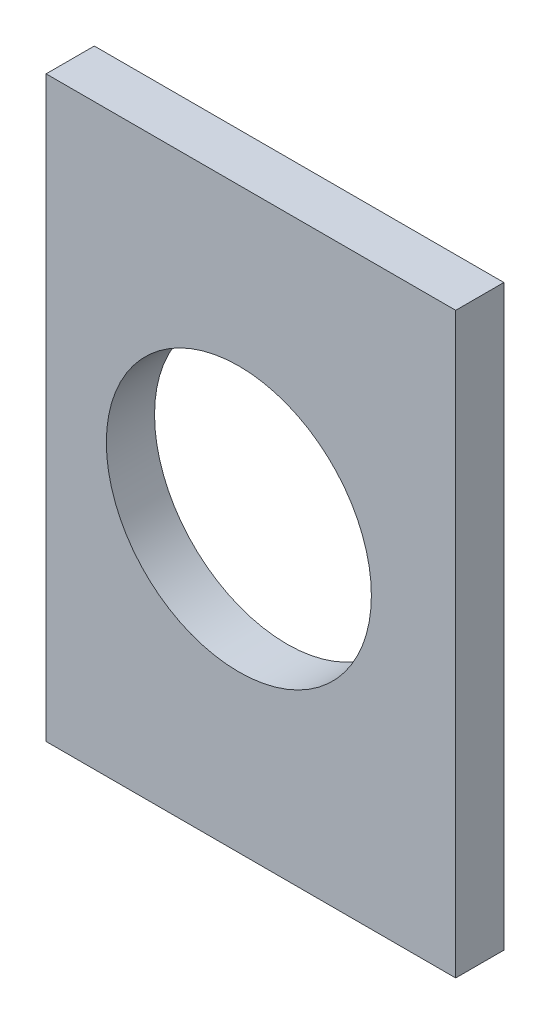
ISO-10303-21;
HEADER;
FILE_DESCRIPTION(('STEP AP214'),'2;1');
FILE_NAME('part.step','',(''),(''),'','','');
FILE_SCHEMA(('AUTOMOTIVE_DESIGN { 1 0 10303 214 1 1 1 1 }'));
ENDSEC;
DATA;
#1=APPLICATION_CONTEXT('core data for automotive mechanical design processes');
#2=APPLICATION_PROTOCOL_DEFINITION('international standard','automotive_design',2000,#1);
#3=PRODUCT_CONTEXT('',#1,'mechanical');
#4=PRODUCT('Part','Part','',(#3));
#5=PRODUCT_RELATED_PRODUCT_CATEGORY('part','',(#4));
#6=PRODUCT_DEFINITION_FORMATION('','',#4);
#7=PRODUCT_DEFINITION_CONTEXT('part definition',#1,'design');
#8=PRODUCT_DEFINITION('design','',#6,#7);
#9=PRODUCT_DEFINITION_SHAPE('','',#8);
#10=(LENGTH_UNIT() NAMED_UNIT(*) SI_UNIT(.MILLI.,.METRE.));
#11=(NAMED_UNIT(*) PLANE_ANGLE_UNIT() SI_UNIT($,.RADIAN.));
#12=(NAMED_UNIT(*) SI_UNIT($,.STERADIAN.) SOLID_ANGLE_UNIT());
#13=UNCERTAINTY_MEASURE_WITH_UNIT(LENGTH_MEASURE(1.E-05),#10,'distance_accuracy_value','');
#14=(GEOMETRIC_REPRESENTATION_CONTEXT(3) GLOBAL_UNCERTAINTY_ASSIGNED_CONTEXT((#13)) GLOBAL_UNIT_ASSIGNED_CONTEXT((#10,
#11,#12)) REPRESENTATION_CONTEXT('',''));
#15=CARTESIAN_POINT('',(0.,0.,0.));
#16=DIRECTION('',(0.,0.,1.));
#17=DIRECTION('',(1.,0.,0.));
#18=AXIS2_PLACEMENT_3D('',#15,#16,#17);
#19=CARTESIAN_POINT('',(0.,0.,1.));
#20=DIRECTION('',(0.,0.,1.));
#21=DIRECTION('',(1.,0.,0.));
#22=AXIS2_PLACEMENT_3D('',#19,#20,#21);
#23=PLANE('',#22);
#24=DIRECTION('',(0.,-1.,0.));
#25=VECTOR('',#24,1.);
#26=CARTESIAN_POINT('',(94.5,6.,1.));
#27=LINE('',#26,#25);
#28=CARTESIAN_POINT('',(94.5,6.,1.));
#29=VERTEX_POINT('',#28);
#30=CARTESIAN_POINT('',(94.5,-6.,1.));
#31=VERTEX_POINT('',#30);
#32=EDGE_CURVE('E91',#29,#31,#27,.T.);
#33=ORIENTED_EDGE('',*,*,#32,.T.);
#34=DIRECTION('',(1.,0.,0.));
#35=VECTOR('',#34,1.);
#36=CARTESIAN_POINT('',(94.5,-6.,1.));
#37=LINE('',#36,#35);
#38=CARTESIAN_POINT('',(103.,-6.,1.));
#39=VERTEX_POINT('',#38);
#40=EDGE_CURVE('E86',#31,#39,#37,.T.);
#41=ORIENTED_EDGE('',*,*,#40,.T.);
#42=DIRECTION('',(0.,1.,0.));
#43=VECTOR('',#42,1.);
#44=CARTESIAN_POINT('',(103.,-6.,1.));
#45=LINE('',#44,#43);
#46=CARTESIAN_POINT('',(103.,6.,1.));
#47=VERTEX_POINT('',#46);
#48=EDGE_CURVE('E89',#39,#47,#45,.T.);
#49=ORIENTED_EDGE('',*,*,#48,.T.);
#50=DIRECTION('',(-1.,0.,0.));
#51=VECTOR('',#50,1.);
#52=CARTESIAN_POINT('',(103.,6.,1.));
#53=LINE('',#52,#51);
#54=EDGE_CURVE('E56',#47,#29,#53,.T.);
#55=ORIENTED_EDGE('',*,*,#54,.T.);
#56=EDGE_LOOP('',(#33,#41,#49,#55));
#57=FACE_BOUND('',#56,.T.);
#58=CARTESIAN_POINT('',(98.5,0.,1.));
#59=DIRECTION('',(0.,0.,1.));
#60=DIRECTION('',(1.,0.,0.));
#61=AXIS2_PLACEMENT_3D('',#58,#59,#60);
#62=CIRCLE('',#61,2.75);
#63=CARTESIAN_POINT('',(101.25,0.,1.));
#64=VERTEX_POINT('',#63);
#65=EDGE_CURVE('E106',#64,#64,#62,.T.);
#66=ORIENTED_EDGE('',*,*,#65,.F.);
#67=EDGE_LOOP('',(#66));
#68=FACE_BOUND('',#67,.T.);
#69=ADVANCED_FACE('F39',(#57,#68),#23,.T.);
#70=CARTESIAN_POINT('',(0.,0.,0.));
#71=DIRECTION('',(0.,0.,1.));
#72=DIRECTION('',(1.,0.,0.));
#73=AXIS2_PLACEMENT_3D('',#70,#71,#72);
#74=PLANE('',#73);
#75=DIRECTION('',(0.,-1.,0.));
#76=VECTOR('',#75,1.);
#77=CARTESIAN_POINT('',(94.5,6.,0.));
#78=LINE('',#77,#76);
#79=CARTESIAN_POINT('',(94.5,6.,0.));
#80=VERTEX_POINT('',#79);
#81=CARTESIAN_POINT('',(94.5,-6.,0.));
#82=VERTEX_POINT('',#81);
#83=EDGE_CURVE('E103',#80,#82,#78,.T.);
#84=ORIENTED_EDGE('',*,*,#83,.F.);
#85=DIRECTION('',(-1.,0.,0.));
#86=VECTOR('',#85,1.);
#87=CARTESIAN_POINT('',(103.,6.,0.));
#88=LINE('',#87,#86);
#89=CARTESIAN_POINT('',(103.,6.,0.));
#90=VERTEX_POINT('',#89);
#91=EDGE_CURVE('E79',#90,#80,#88,.T.);
#92=ORIENTED_EDGE('',*,*,#91,.F.);
#93=DIRECTION('',(0.,1.,0.));
#94=VECTOR('',#93,1.);
#95=CARTESIAN_POINT('',(103.,-6.,0.));
#96=LINE('',#95,#94);
#97=CARTESIAN_POINT('',(103.,-6.,0.));
#98=VERTEX_POINT('',#97);
#99=EDGE_CURVE('E73',#98,#90,#96,.T.);
#100=ORIENTED_EDGE('',*,*,#99,.F.);
#101=DIRECTION('',(1.,0.,0.));
#102=VECTOR('',#101,1.);
#103=CARTESIAN_POINT('',(94.5,-6.,0.));
#104=LINE('',#103,#102);
#105=EDGE_CURVE('E95',#82,#98,#104,.T.);
#106=ORIENTED_EDGE('',*,*,#105,.F.);
#107=EDGE_LOOP('',(#84,#92,#100,#106));
#108=FACE_BOUND('',#107,.T.);
#109=CARTESIAN_POINT('',(98.5,0.,0.));
#110=DIRECTION('',(0.,0.,1.));
#111=DIRECTION('',(1.,0.,0.));
#112=AXIS2_PLACEMENT_3D('',#109,#110,#111);
#113=CIRCLE('',#112,2.75);
#114=CARTESIAN_POINT('',(101.25,0.,0.));
#115=VERTEX_POINT('',#114);
#116=EDGE_CURVE('E118',#115,#115,#113,.T.);
#117=ORIENTED_EDGE('',*,*,#116,.T.);
#118=EDGE_LOOP('',(#117));
#119=FACE_BOUND('',#118,.T.);
#120=ADVANCED_FACE('F114',(#108,#119),#74,.F.);
#121=CARTESIAN_POINT('',(94.5,6.,1.));
#122=DIRECTION('',(1.,0.,0.));
#123=DIRECTION('',(0.,0.,-1.));
#124=AXIS2_PLACEMENT_3D('',#121,#122,#123);
#125=PLANE('',#124);
#126=ORIENTED_EDGE('',*,*,#83,.T.);
#127=DIRECTION('',(0.,0.,-1.));
#128=VECTOR('',#127,1.);
#129=CARTESIAN_POINT('',(94.5,-6.,1.));
#130=LINE('',#129,#128);
#131=EDGE_CURVE('E11',#31,#82,#130,.T.);
#132=ORIENTED_EDGE('',*,*,#131,.F.);
#133=ORIENTED_EDGE('',*,*,#32,.F.);
#134=DIRECTION('',(0.,0.,-1.));
#135=VECTOR('',#134,1.);
#136=CARTESIAN_POINT('',(94.5,6.,1.));
#137=LINE('',#136,#135);
#138=EDGE_CURVE('E99',#29,#80,#137,.T.);
#139=ORIENTED_EDGE('',*,*,#138,.T.);
#140=EDGE_LOOP('',(#126,#132,#133,#139));
#141=FACE_BOUND('',#140,.T.);
#142=ADVANCED_FACE('F41',(#141),#125,.F.);
#143=CARTESIAN_POINT('',(94.5,-6.,1.));
#144=DIRECTION('',(0.,1.,0.));
#145=DIRECTION('',(0.,0.,1.));
#146=AXIS2_PLACEMENT_3D('',#143,#144,#145);
#147=PLANE('',#146);
#148=ORIENTED_EDGE('',*,*,#105,.T.);
#149=DIRECTION('',(0.,0.,-1.));
#150=VECTOR('',#149,1.);
#151=CARTESIAN_POINT('',(103.,-6.,1.));
#152=LINE('',#151,#150);
#153=EDGE_CURVE('E48',#39,#98,#152,.T.);
#154=ORIENTED_EDGE('',*,*,#153,.F.);
#155=ORIENTED_EDGE('',*,*,#40,.F.);
#156=ORIENTED_EDGE('',*,*,#131,.T.);
#157=EDGE_LOOP('',(#148,#154,#155,#156));
#158=FACE_BOUND('',#157,.T.);
#159=ADVANCED_FACE('F94',(#158),#147,.F.);
#160=CARTESIAN_POINT('',(103.,-6.,1.));
#161=DIRECTION('',(-1.,0.,0.));
#162=DIRECTION('',(0.,0.,1.));
#163=AXIS2_PLACEMENT_3D('',#160,#161,#162);
#164=PLANE('',#163);
#165=ORIENTED_EDGE('',*,*,#99,.T.);
#166=DIRECTION('',(0.,0.,-1.));
#167=VECTOR('',#166,1.);
#168=CARTESIAN_POINT('',(103.,6.,1.));
#169=LINE('',#168,#167);
#170=EDGE_CURVE('E96',#47,#90,#169,.T.);
#171=ORIENTED_EDGE('',*,*,#170,.F.);
#172=ORIENTED_EDGE('',*,*,#48,.F.);
#173=ORIENTED_EDGE('',*,*,#153,.T.);
#174=EDGE_LOOP('',(#165,#171,#172,#173));
#175=FACE_BOUND('',#174,.T.);
#176=ADVANCED_FACE('F97',(#175),#164,.F.);
#177=CARTESIAN_POINT('',(103.,6.,1.));
#178=DIRECTION('',(0.,-1.,0.));
#179=DIRECTION('',(0.,0.,-1.));
#180=AXIS2_PLACEMENT_3D('',#177,#178,#179);
#181=PLANE('',#180);
#182=ORIENTED_EDGE('',*,*,#91,.T.);
#183=ORIENTED_EDGE('',*,*,#138,.F.);
#184=ORIENTED_EDGE('',*,*,#54,.F.);
#185=ORIENTED_EDGE('',*,*,#170,.T.);
#186=EDGE_LOOP('',(#182,#183,#184,#185));
#187=FACE_BOUND('',#186,.T.);
#188=ADVANCED_FACE('F111',(#187),#181,.F.);
#189=CARTESIAN_POINT('',(98.5,0.,1.));
#190=DIRECTION('',(0.,0.,-1.));
#191=DIRECTION('',(-1.,0.,0.));
#192=AXIS2_PLACEMENT_3D('',#189,#190,#191);
#193=CYLINDRICAL_SURFACE('',#192,2.75);
#194=ORIENTED_EDGE('',*,*,#65,.T.);
#195=EDGE_LOOP('',(#194));
#196=FACE_BOUND('',#195,.T.);
#197=ORIENTED_EDGE('',*,*,#116,.F.);
#198=EDGE_LOOP('',(#197));
#199=FACE_BOUND('',#198,.T.);
#200=ADVANCED_FACE('F124',(#196,#199),#193,.F.);
#201=CLOSED_SHELL('',(#69,#120,#142,#159,#176,#188,#200));
#202=MANIFOLD_SOLID_BREP('B2',#201);
#203=ADVANCED_BREP_SHAPE_REPRESENTATION('',(#18,#202),#14);
#204=SHAPE_DEFINITION_REPRESENTATION(#9,#203);
ENDSEC;
END-ISO-10303-21;
